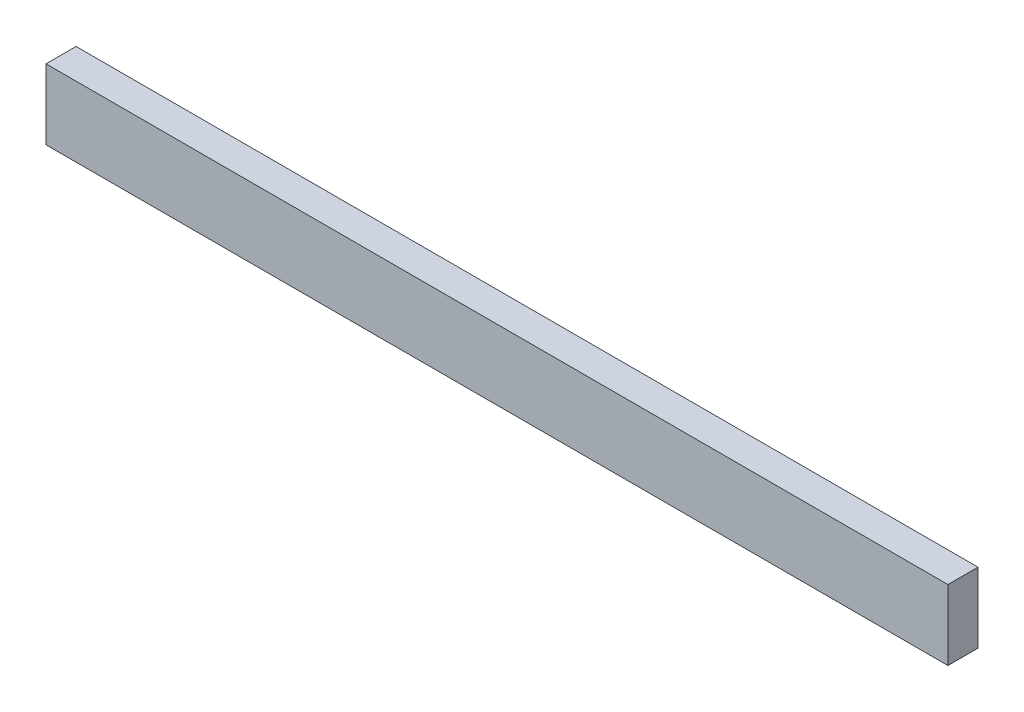
ISO-10303-21;
HEADER;
FILE_DESCRIPTION(('STEP AP214'),'2;1');
FILE_NAME('part.step','',(''),(''),'','','');
FILE_SCHEMA(('AUTOMOTIVE_DESIGN { 1 0 10303 214 1 1 1 1 }'));
ENDSEC;
DATA;
#1=APPLICATION_CONTEXT('core data for automotive mechanical design processes');
#2=APPLICATION_PROTOCOL_DEFINITION('international standard','automotive_design',2000,#1);
#3=PRODUCT_CONTEXT('',#1,'mechanical');
#4=PRODUCT('Part','Part','',(#3));
#5=PRODUCT_RELATED_PRODUCT_CATEGORY('part','',(#4));
#6=PRODUCT_DEFINITION_FORMATION('','',#4);
#7=PRODUCT_DEFINITION_CONTEXT('part definition',#1,'design');
#8=PRODUCT_DEFINITION('design','',#6,#7);
#9=PRODUCT_DEFINITION_SHAPE('','',#8);
#10=(LENGTH_UNIT() NAMED_UNIT(*) SI_UNIT(.MILLI.,.METRE.));
#11=(NAMED_UNIT(*) PLANE_ANGLE_UNIT() SI_UNIT($,.RADIAN.));
#12=(NAMED_UNIT(*) SI_UNIT($,.STERADIAN.) SOLID_ANGLE_UNIT());
#13=UNCERTAINTY_MEASURE_WITH_UNIT(LENGTH_MEASURE(1.E-05),#10,'distance_accuracy_value','');
#14=(GEOMETRIC_REPRESENTATION_CONTEXT(3) GLOBAL_UNCERTAINTY_ASSIGNED_CONTEXT((#13)) GLOBAL_UNIT_ASSIGNED_CONTEXT((#10,
#11,#12)) REPRESENTATION_CONTEXT('',''));
#15=CARTESIAN_POINT('',(0.,0.,0.));
#16=DIRECTION('',(0.,0.,1.));
#17=DIRECTION('',(1.,0.,0.));
#18=AXIS2_PLACEMENT_3D('',#15,#16,#17);
#19=CARTESIAN_POINT('',(1143.,-44.45,-19.05));
#20=DIRECTION('',(0.,0.,1.));
#21=DIRECTION('',(1.,0.,0.));
#22=AXIS2_PLACEMENT_3D('',#19,#20,#21);
#23=PLANE('',#22);
#24=DIRECTION('',(0.,1.,0.));
#25=VECTOR('',#24,1.);
#26=CARTESIAN_POINT('',(0.,-44.45,-19.05));
#27=LINE('',#26,#25);
#28=CARTESIAN_POINT('',(0.,-44.45,-19.05));
#29=VERTEX_POINT('',#28);
#30=CARTESIAN_POINT('',(0.,44.45,-19.05));
#31=VERTEX_POINT('',#30);
#32=EDGE_CURVE('E100',#29,#31,#27,.T.);
#33=ORIENTED_EDGE('',*,*,#32,.T.);
#34=DIRECTION('',(-1.,0.,0.));
#35=VECTOR('',#34,1.);
#36=CARTESIAN_POINT('',(1143.,44.45,-19.05));
#37=LINE('',#36,#35);
#38=CARTESIAN_POINT('',(1143.,44.45,-19.05));
#39=VERTEX_POINT('',#38);
#40=EDGE_CURVE('E11',#39,#31,#37,.T.);
#41=ORIENTED_EDGE('',*,*,#40,.F.);
#42=DIRECTION('',(0.,1.,0.));
#43=VECTOR('',#42,1.);
#44=CARTESIAN_POINT('',(1143.,-44.45,-19.05));
#45=LINE('',#44,#43);
#46=CARTESIAN_POINT('',(1143.,-44.45,-19.05));
#47=VERTEX_POINT('',#46);
#48=EDGE_CURVE('E88',#47,#39,#45,.T.);
#49=ORIENTED_EDGE('',*,*,#48,.F.);
#50=DIRECTION('',(-1.,0.,0.));
#51=VECTOR('',#50,1.);
#52=CARTESIAN_POINT('',(1143.,-44.45,-19.05));
#53=LINE('',#52,#51);
#54=EDGE_CURVE('E96',#47,#29,#53,.T.);
#55=ORIENTED_EDGE('',*,*,#54,.T.);
#56=EDGE_LOOP('',(#33,#41,#49,#55));
#57=FACE_BOUND('',#56,.T.);
#58=ADVANCED_FACE('F37',(#57),#23,.F.);
#59=CARTESIAN_POINT('',(1143.,44.45,19.05));
#60=DIRECTION('',(0.,-1.,0.));
#61=DIRECTION('',(0.,0.,-1.));
#62=AXIS2_PLACEMENT_3D('',#59,#60,#61);
#63=PLANE('',#62);
#64=DIRECTION('',(0.,0.,1.));
#65=VECTOR('',#64,1.);
#66=CARTESIAN_POINT('',(0.,44.45,19.05));
#67=LINE('',#66,#65);
#68=CARTESIAN_POINT('',(0.,44.45,19.05));
#69=VERTEX_POINT('',#68);
#70=EDGE_CURVE('E92',#31,#69,#67,.T.);
#71=ORIENTED_EDGE('',*,*,#70,.T.);
#72=DIRECTION('',(-1.,0.,0.));
#73=VECTOR('',#72,1.);
#74=CARTESIAN_POINT('',(1143.,44.45,19.05));
#75=LINE('',#74,#73);
#76=CARTESIAN_POINT('',(1143.,44.45,19.05));
#77=VERTEX_POINT('',#76);
#78=EDGE_CURVE('E45',#77,#69,#75,.T.);
#79=ORIENTED_EDGE('',*,*,#78,.F.);
#80=DIRECTION('',(0.,0.,1.));
#81=VECTOR('',#80,1.);
#82=CARTESIAN_POINT('',(1143.,44.45,19.05));
#83=LINE('',#82,#81);
#84=EDGE_CURVE('E83',#39,#77,#83,.T.);
#85=ORIENTED_EDGE('',*,*,#84,.F.);
#86=ORIENTED_EDGE('',*,*,#40,.T.);
#87=EDGE_LOOP('',(#71,#79,#85,#86));
#88=FACE_BOUND('',#87,.T.);
#89=ADVANCED_FACE('F91',(#88),#63,.F.);
#90=CARTESIAN_POINT('',(1143.,-44.45,19.05));
#91=DIRECTION('',(0.,0.,-1.));
#92=DIRECTION('',(-1.,0.,0.));
#93=AXIS2_PLACEMENT_3D('',#90,#91,#92);
#94=PLANE('',#93);
#95=DIRECTION('',(0.,-1.,0.));
#96=VECTOR('',#95,1.);
#97=CARTESIAN_POINT('',(0.,-44.45,19.05));
#98=LINE('',#97,#96);
#99=CARTESIAN_POINT('',(0.,-44.45,19.05));
#100=VERTEX_POINT('',#99);
#101=EDGE_CURVE('E70',#69,#100,#98,.T.);
#102=ORIENTED_EDGE('',*,*,#101,.T.);
#103=DIRECTION('',(-1.,0.,0.));
#104=VECTOR('',#103,1.);
#105=CARTESIAN_POINT('',(1143.,-44.45,19.05));
#106=LINE('',#105,#104);
#107=CARTESIAN_POINT('',(1143.,-44.45,19.05));
#108=VERTEX_POINT('',#107);
#109=EDGE_CURVE('E93',#108,#100,#106,.T.);
#110=ORIENTED_EDGE('',*,*,#109,.F.);
#111=DIRECTION('',(0.,-1.,0.));
#112=VECTOR('',#111,1.);
#113=CARTESIAN_POINT('',(1143.,-44.45,19.05));
#114=LINE('',#113,#112);
#115=EDGE_CURVE('E86',#77,#108,#114,.T.);
#116=ORIENTED_EDGE('',*,*,#115,.F.);
#117=ORIENTED_EDGE('',*,*,#78,.T.);
#118=EDGE_LOOP('',(#102,#110,#116,#117));
#119=FACE_BOUND('',#118,.T.);
#120=ADVANCED_FACE('F94',(#119),#94,.F.);
#121=CARTESIAN_POINT('',(1143.,-44.45,19.05));
#122=DIRECTION('',(0.,1.,0.));
#123=DIRECTION('',(0.,0.,1.));
#124=AXIS2_PLACEMENT_3D('',#121,#122,#123);
#125=PLANE('',#124);
#126=DIRECTION('',(0.,0.,-1.));
#127=VECTOR('',#126,1.);
#128=CARTESIAN_POINT('',(0.,-44.45,19.05));
#129=LINE('',#128,#127);
#130=EDGE_CURVE('E76',#100,#29,#129,.T.);
#131=ORIENTED_EDGE('',*,*,#130,.T.);
#132=ORIENTED_EDGE('',*,*,#54,.F.);
#133=DIRECTION('',(0.,0.,-1.));
#134=VECTOR('',#133,1.);
#135=CARTESIAN_POINT('',(1143.,-44.45,19.05));
#136=LINE('',#135,#134);
#137=EDGE_CURVE('E53',#108,#47,#136,.T.);
#138=ORIENTED_EDGE('',*,*,#137,.F.);
#139=ORIENTED_EDGE('',*,*,#109,.T.);
#140=EDGE_LOOP('',(#131,#132,#138,#139));
#141=FACE_BOUND('',#140,.T.);
#142=ADVANCED_FACE('F107',(#141),#125,.F.);
#143=CARTESIAN_POINT('',(1143.,0.,0.));
#144=DIRECTION('',(-1.,0.,0.));
#145=DIRECTION('',(0.,0.,1.));
#146=AXIS2_PLACEMENT_3D('',#143,#144,#145);
#147=PLANE('',#146);
#148=ORIENTED_EDGE('',*,*,#48,.T.);
#149=ORIENTED_EDGE('',*,*,#84,.T.);
#150=ORIENTED_EDGE('',*,*,#115,.T.);
#151=ORIENTED_EDGE('',*,*,#137,.T.);
#152=EDGE_LOOP('',(#148,#149,#150,#151));
#153=FACE_BOUND('',#152,.T.);
#154=ADVANCED_FACE('F84',(#153),#147,.F.);
#155=CARTESIAN_POINT('',(0.,0.,0.));
#156=DIRECTION('',(-1.,0.,0.));
#157=DIRECTION('',(0.,0.,1.));
#158=AXIS2_PLACEMENT_3D('',#155,#156,#157);
#159=PLANE('',#158);
#160=ORIENTED_EDGE('',*,*,#32,.F.);
#161=ORIENTED_EDGE('',*,*,#130,.F.);
#162=ORIENTED_EDGE('',*,*,#101,.F.);
#163=ORIENTED_EDGE('',*,*,#70,.F.);
#164=EDGE_LOOP('',(#160,#161,#162,#163));
#165=FACE_BOUND('',#164,.T.);
#166=ADVANCED_FACE('F110',(#165),#159,.T.);
#167=CLOSED_SHELL('',(#58,#89,#120,#142,#154,#166));
#168=MANIFOLD_SOLID_BREP('B2',#167);
#169=ADVANCED_BREP_SHAPE_REPRESENTATION('',(#18,#168),#14);
#170=SHAPE_DEFINITION_REPRESENTATION(#9,#169);
ENDSEC;
END-ISO-10303-21;
